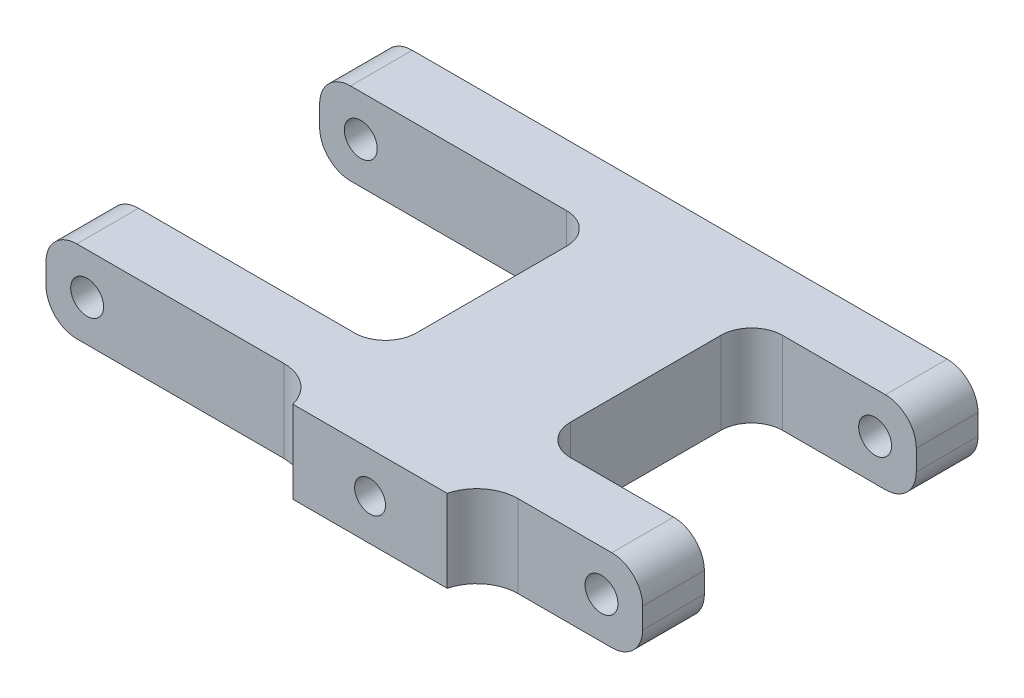
ISO-10303-21;
HEADER;
FILE_DESCRIPTION(('STEP AP214'),'2;1');
FILE_NAME('part.step','',(''),(''),'','','');
FILE_SCHEMA(('AUTOMOTIVE_DESIGN { 1 0 10303 214 1 1 1 1 }'));
ENDSEC;
DATA;
#1=APPLICATION_CONTEXT('core data for automotive mechanical design processes');
#2=APPLICATION_PROTOCOL_DEFINITION('international standard','automotive_design',2000,#1);
#3=PRODUCT_CONTEXT('',#1,'mechanical');
#4=PRODUCT('Part','Part','',(#3));
#5=PRODUCT_RELATED_PRODUCT_CATEGORY('part','',(#4));
#6=PRODUCT_DEFINITION_FORMATION('','',#4);
#7=PRODUCT_DEFINITION_CONTEXT('part definition',#1,'design');
#8=PRODUCT_DEFINITION('design','',#6,#7);
#9=PRODUCT_DEFINITION_SHAPE('','',#8);
#10=(LENGTH_UNIT() NAMED_UNIT(*) SI_UNIT(.MILLI.,.METRE.));
#11=(NAMED_UNIT(*) PLANE_ANGLE_UNIT() SI_UNIT($,.RADIAN.));
#12=(NAMED_UNIT(*) SI_UNIT($,.STERADIAN.) SOLID_ANGLE_UNIT());
#13=UNCERTAINTY_MEASURE_WITH_UNIT(LENGTH_MEASURE(1.E-05),#10,'distance_accuracy_value','');
#14=(GEOMETRIC_REPRESENTATION_CONTEXT(3) GLOBAL_UNCERTAINTY_ASSIGNED_CONTEXT((#13)) GLOBAL_UNIT_ASSIGNED_CONTEXT((#10,
#11,#12)) REPRESENTATION_CONTEXT('',''));
#15=CARTESIAN_POINT('',(0.,0.,0.));
#16=DIRECTION('',(0.,0.,1.));
#17=DIRECTION('',(1.,0.,0.));
#18=AXIS2_PLACEMENT_3D('',#15,#16,#17);
#19=CARTESIAN_POINT('',(0.,8.,32.6));
#20=DIRECTION('',(0.,0.,-1.));
#21=DIRECTION('',(-1.,0.,0.));
#22=AXIS2_PLACEMENT_3D('',#19,#20,#21);
#23=PLANE('',#22);
#24=CARTESIAN_POINT('',(4.,4.,32.6));
#25=DIRECTION('',(0.,0.,1.));
#26=DIRECTION('',(1.,0.,0.));
#27=AXIS2_PLACEMENT_3D('',#24,#25,#26);
#28=CIRCLE('',#27,1.6);
#29=CARTESIAN_POINT('',(5.6,4.,32.6));
#30=VERTEX_POINT('',#29);
#31=EDGE_CURVE('E254',#30,#30,#28,.T.);
#32=ORIENTED_EDGE('',*,*,#31,.F.);
#33=EDGE_LOOP('',(#32));
#34=FACE_BOUND('',#33,.T.);
#35=DIRECTION('',(1.,0.,0.));
#36=VECTOR('',#35,1.);
#37=CARTESIAN_POINT('',(0.,0.,32.6));
#38=LINE('',#37,#36);
#39=CARTESIAN_POINT('',(3.,0.,32.6));
#40=VERTEX_POINT('',#39);
#41=CARTESIAN_POINT('',(23.1270166537926,0.,32.6));
#42=VERTEX_POINT('',#41);
#43=EDGE_CURVE('E312',#40,#42,#38,.T.);
#44=ORIENTED_EDGE('',*,*,#43,.T.);
#45=DIRECTION('',(0.,-1.,0.));
#46=VECTOR('',#45,1.);
#47=CARTESIAN_POINT('',(23.1270166537926,8.,32.6));
#48=LINE('',#47,#46);
#49=CARTESIAN_POINT('',(23.1270166537926,8.,32.6));
#50=VERTEX_POINT('',#49);
#51=EDGE_CURVE('E54',#42,#50,#48,.F.);
#52=ORIENTED_EDGE('',*,*,#51,.T.);
#53=DIRECTION('',(1.,0.,0.));
#54=VECTOR('',#53,1.);
#55=CARTESIAN_POINT('',(0.,8.,32.6));
#56=LINE('',#55,#54);
#57=CARTESIAN_POINT('',(3.,8.,32.6));
#58=VERTEX_POINT('',#57);
#59=EDGE_CURVE('E305',#58,#50,#56,.T.);
#60=ORIENTED_EDGE('',*,*,#59,.F.);
#61=CARTESIAN_POINT('',(3.,5.,32.6));
#62=DIRECTION('',(0.,0.,-1.));
#63=DIRECTION('',(-1.,0.,0.));
#64=AXIS2_PLACEMENT_3D('',#61,#62,#63);
#65=CIRCLE('',#64,3.);
#66=CARTESIAN_POINT('',(0.,5.,32.6));
#67=VERTEX_POINT('',#66);
#68=EDGE_CURVE('E342',#58,#67,#65,.F.);
#69=ORIENTED_EDGE('',*,*,#68,.T.);
#70=DIRECTION('',(0.,-1.,0.));
#71=VECTOR('',#70,1.);
#72=CARTESIAN_POINT('',(0.,8.,32.6));
#73=LINE('',#72,#71);
#74=CARTESIAN_POINT('',(0.,3.,32.6));
#75=VERTEX_POINT('',#74);
#76=EDGE_CURVE('E325',#67,#75,#73,.T.);
#77=ORIENTED_EDGE('',*,*,#76,.T.);
#78=CARTESIAN_POINT('',(3.,3.,32.6));
#79=DIRECTION('',(0.,0.,-1.));
#80=DIRECTION('',(-1.,0.,0.));
#81=AXIS2_PLACEMENT_3D('',#78,#79,#80);
#82=CIRCLE('',#81,3.);
#83=EDGE_CURVE('E344',#75,#40,#82,.F.);
#84=ORIENTED_EDGE('',*,*,#83,.T.);
#85=EDGE_LOOP('',(#44,#52,#60,#69,#77,#84));
#86=FACE_BOUND('',#85,.T.);
#87=ADVANCED_FACE('F33',(#34,#86),#23,.F.);
#88=CARTESIAN_POINT('',(54.,4.,32.6));
#89=DIRECTION('',(0.,0.,1.));
#90=DIRECTION('',(1.,0.,0.));
#91=AXIS2_PLACEMENT_3D('',#88,#89,#90);
#92=CIRCLE('',#91,1.59999999999999);
#93=CARTESIAN_POINT('',(55.6,4.,32.6));
#94=VERTEX_POINT('',#93);
#95=EDGE_CURVE('E244',#94,#94,#92,.T.);
#96=ORIENTED_EDGE('',*,*,#95,.F.);
#97=EDGE_LOOP('',(#96));
#98=FACE_BOUND('',#97,.T.);
#99=CARTESIAN_POINT('',(45.8729833462074,8.,32.6));
#100=VERTEX_POINT('',#99);
#101=CARTESIAN_POINT('',(55.,8.,32.6));
#102=VERTEX_POINT('',#101);
#103=EDGE_CURVE('E308',#100,#102,#56,.T.);
#104=ORIENTED_EDGE('',*,*,#103,.F.);
#105=DIRECTION('',(0.,1.,0.));
#106=VECTOR('',#105,1.);
#107=CARTESIAN_POINT('',(45.8729833462074,8.,32.6));
#108=LINE('',#107,#106);
#109=CARTESIAN_POINT('',(45.8729833462074,0.,32.6));
#110=VERTEX_POINT('',#109);
#111=EDGE_CURVE('E448',#100,#110,#108,.F.);
#112=ORIENTED_EDGE('',*,*,#111,.T.);
#113=CARTESIAN_POINT('',(55.,0.,32.6));
#114=VERTEX_POINT('',#113);
#115=EDGE_CURVE('E299',#110,#114,#38,.T.);
#116=ORIENTED_EDGE('',*,*,#115,.T.);
#117=CARTESIAN_POINT('',(55.,3.,32.6));
#118=DIRECTION('',(0.,0.,-1.));
#119=DIRECTION('',(-1.,0.,0.));
#120=AXIS2_PLACEMENT_3D('',#117,#118,#119);
#121=CIRCLE('',#120,3.);
#122=CARTESIAN_POINT('',(58.,3.,32.6));
#123=VERTEX_POINT('',#122);
#124=EDGE_CURVE('E340',#114,#123,#121,.F.);
#125=ORIENTED_EDGE('',*,*,#124,.T.);
#126=DIRECTION('',(0.,-1.,0.));
#127=VECTOR('',#126,1.);
#128=CARTESIAN_POINT('',(58.,8.,32.6));
#129=LINE('',#128,#127);
#130=CARTESIAN_POINT('',(58.,5.,32.6));
#131=VERTEX_POINT('',#130);
#132=EDGE_CURVE('E322',#131,#123,#129,.T.);
#133=ORIENTED_EDGE('',*,*,#132,.F.);
#134=CARTESIAN_POINT('',(55.,5.,32.6));
#135=DIRECTION('',(0.,0.,-1.));
#136=DIRECTION('',(-1.,0.,0.));
#137=AXIS2_PLACEMENT_3D('',#134,#135,#136);
#138=CIRCLE('',#137,3.);
#139=EDGE_CURVE('E337',#131,#102,#138,.F.);
#140=ORIENTED_EDGE('',*,*,#139,.T.);
#141=EDGE_LOOP('',(#104,#112,#116,#125,#133,#140));
#142=FACE_BOUND('',#141,.T.);
#143=ADVANCED_FACE('F460',(#98,#142),#23,.F.);
#144=CARTESIAN_POINT('',(0.,8.,0.));
#145=DIRECTION('',(1.,0.,0.));
#146=DIRECTION('',(0.,0.,-1.));
#147=AXIS2_PLACEMENT_3D('',#144,#145,#146);
#148=PLANE('',#147);
#149=DIRECTION('',(0.,-1.,0.));
#150=VECTOR('',#149,1.);
#151=CARTESIAN_POINT('',(0.,8.,0.));
#152=LINE('',#151,#150);
#153=CARTESIAN_POINT('',(0.,5.,0.));
#154=VERTEX_POINT('',#153);
#155=CARTESIAN_POINT('',(0.,3.,0.));
#156=VERTEX_POINT('',#155);
#157=EDGE_CURVE('E311',#154,#156,#152,.T.);
#158=ORIENTED_EDGE('',*,*,#157,.T.);
#159=DIRECTION('',(0.,0.,1.));
#160=VECTOR('',#159,1.);
#161=CARTESIAN_POINT('',(0.,3.,0.));
#162=LINE('',#161,#160);
#163=CARTESIAN_POINT('',(0.,3.,6.));
#164=VERTEX_POINT('',#163);
#165=EDGE_CURVE('E376',#156,#164,#162,.T.);
#166=ORIENTED_EDGE('',*,*,#165,.T.);
#167=DIRECTION('',(0.,-1.,0.));
#168=VECTOR('',#167,1.);
#169=CARTESIAN_POINT('',(0.,8.,6.));
#170=LINE('',#169,#168);
#171=CARTESIAN_POINT('',(0.,5.,6.));
#172=VERTEX_POINT('',#171);
#173=EDGE_CURVE('E264',#172,#164,#170,.T.);
#174=ORIENTED_EDGE('',*,*,#173,.F.);
#175=DIRECTION('',(0.,0.,1.));
#176=VECTOR('',#175,1.);
#177=CARTESIAN_POINT('',(0.,5.,0.));
#178=LINE('',#177,#176);
#179=EDGE_CURVE('E374',#172,#154,#178,.F.);
#180=ORIENTED_EDGE('',*,*,#179,.T.);
#181=EDGE_LOOP('',(#158,#166,#174,#180));
#182=FACE_BOUND('',#181,.T.);
#183=ADVANCED_FACE('F481',(#182),#148,.F.);
#184=CARTESIAN_POINT('',(58.,8.,0.));
#185=DIRECTION('',(-1.,0.,0.));
#186=DIRECTION('',(0.,0.,1.));
#187=AXIS2_PLACEMENT_3D('',#184,#185,#186);
#188=PLANE('',#187);
#189=ORIENTED_EDGE('',*,*,#132,.T.);
#190=DIRECTION('',(0.,0.,-1.));
#191=VECTOR('',#190,1.);
#192=CARTESIAN_POINT('',(58.,3.,0.));
#193=LINE('',#192,#191);
#194=CARTESIAN_POINT('',(58.,3.,26.6));
#195=VERTEX_POINT('',#194);
#196=EDGE_CURVE('E404',#123,#195,#193,.T.);
#197=ORIENTED_EDGE('',*,*,#196,.T.);
#198=DIRECTION('',(0.,-1.,0.));
#199=VECTOR('',#198,1.);
#200=CARTESIAN_POINT('',(58.,8.,26.6));
#201=LINE('',#200,#199);
#202=CARTESIAN_POINT('',(58.,5.,26.6));
#203=VERTEX_POINT('',#202);
#204=EDGE_CURVE('E279',#203,#195,#201,.T.);
#205=ORIENTED_EDGE('',*,*,#204,.F.);
#206=DIRECTION('',(0.,0.,-1.));
#207=VECTOR('',#206,1.);
#208=CARTESIAN_POINT('',(58.,5.,32.6));
#209=LINE('',#208,#207);
#210=EDGE_CURVE('E402',#203,#131,#209,.F.);
#211=ORIENTED_EDGE('',*,*,#210,.T.);
#212=EDGE_LOOP('',(#189,#197,#205,#211));
#213=FACE_BOUND('',#212,.T.);
#214=ADVANCED_FACE('F491',(#213),#188,.F.);
#215=DIRECTION('',(0.,1.,0.));
#216=VECTOR('',#215,1.);
#217=CARTESIAN_POINT('',(0.,8.,26.6));
#218=LINE('',#217,#216);
#219=CARTESIAN_POINT('',(0.,3.,26.6));
#220=VERTEX_POINT('',#219);
#221=CARTESIAN_POINT('',(0.,5.,26.6));
#222=VERTEX_POINT('',#221);
#223=EDGE_CURVE('E269',#220,#222,#218,.T.);
#224=ORIENTED_EDGE('',*,*,#223,.F.);
#225=DIRECTION('',(0.,0.,1.));
#226=VECTOR('',#225,1.);
#227=CARTESIAN_POINT('',(0.,3.,0.));
#228=LINE('',#227,#226);
#229=EDGE_CURVE('E334',#220,#75,#228,.T.);
#230=ORIENTED_EDGE('',*,*,#229,.T.);
#231=ORIENTED_EDGE('',*,*,#76,.F.);
#232=DIRECTION('',(0.,0.,1.));
#233=VECTOR('',#232,1.);
#234=CARTESIAN_POINT('',(0.,5.,26.6));
#235=LINE('',#234,#233);
#236=EDGE_CURVE('E328',#67,#222,#235,.F.);
#237=ORIENTED_EDGE('',*,*,#236,.T.);
#238=EDGE_LOOP('',(#224,#230,#231,#237));
#239=FACE_BOUND('',#238,.T.);
#240=ADVANCED_FACE('F488',(#239),#148,.F.);
#241=DIRECTION('',(0.,-1.,0.));
#242=VECTOR('',#241,1.);
#243=CARTESIAN_POINT('',(58.,8.,0.));
#244=LINE('',#243,#242);
#245=CARTESIAN_POINT('',(58.,5.,0.));
#246=VERTEX_POINT('',#245);
#247=CARTESIAN_POINT('',(58.,3.,0.));
#248=VERTEX_POINT('',#247);
#249=EDGE_CURVE('E319',#246,#248,#244,.T.);
#250=ORIENTED_EDGE('',*,*,#249,.F.);
#251=DIRECTION('',(0.,0.,-1.));
#252=VECTOR('',#251,1.);
#253=CARTESIAN_POINT('',(58.,5.,6.));
#254=LINE('',#253,#252);
#255=CARTESIAN_POINT('',(58.,5.,6.));
#256=VERTEX_POINT('',#255);
#257=EDGE_CURVE('E395',#246,#256,#254,.F.);
#258=ORIENTED_EDGE('',*,*,#257,.T.);
#259=DIRECTION('',(0.,1.,0.));
#260=VECTOR('',#259,1.);
#261=CARTESIAN_POINT('',(58.,8.,6.));
#262=LINE('',#261,#260);
#263=CARTESIAN_POINT('',(58.,3.,6.));
#264=VERTEX_POINT('',#263);
#265=EDGE_CURVE('E289',#264,#256,#262,.T.);
#266=ORIENTED_EDGE('',*,*,#265,.F.);
#267=DIRECTION('',(0.,0.,-1.));
#268=VECTOR('',#267,1.);
#269=CARTESIAN_POINT('',(58.,3.,0.));
#270=LINE('',#269,#268);
#271=EDGE_CURVE('E392',#264,#248,#270,.T.);
#272=ORIENTED_EDGE('',*,*,#271,.T.);
#273=EDGE_LOOP('',(#250,#258,#266,#272));
#274=FACE_BOUND('',#273,.T.);
#275=ADVANCED_FACE('F486',(#274),#188,.F.);
#276=CARTESIAN_POINT('',(0.,8.,0.));
#277=DIRECTION('',(0.,0.,1.));
#278=DIRECTION('',(1.,0.,0.));
#279=AXIS2_PLACEMENT_3D('',#276,#277,#278);
#280=PLANE('',#279);
#281=CARTESIAN_POINT('',(54.,4.,0.));
#282=DIRECTION('',(0.,0.,1.));
#283=DIRECTION('',(1.,0.,0.));
#284=AXIS2_PLACEMENT_3D('',#281,#282,#283);
#285=CIRCLE('',#284,1.59999999999999);
#286=CARTESIAN_POINT('',(55.6,4.,0.));
#287=VERTEX_POINT('',#286);
#288=EDGE_CURVE('E245',#287,#287,#285,.T.);
#289=ORIENTED_EDGE('',*,*,#288,.T.);
#290=EDGE_LOOP('',(#289));
#291=FACE_BOUND('',#290,.T.);
#292=CARTESIAN_POINT('',(4.,4.,0.));
#293=DIRECTION('',(0.,0.,1.));
#294=DIRECTION('',(1.,0.,0.));
#295=AXIS2_PLACEMENT_3D('',#292,#293,#294);
#296=CIRCLE('',#295,1.6);
#297=CARTESIAN_POINT('',(5.6,4.,0.));
#298=VERTEX_POINT('',#297);
#299=EDGE_CURVE('E255',#298,#298,#296,.T.);
#300=ORIENTED_EDGE('',*,*,#299,.T.);
#301=EDGE_LOOP('',(#300));
#302=FACE_BOUND('',#301,.T.);
#303=DIRECTION('',(-1.,0.,0.));
#304=VECTOR('',#303,1.);
#305=CARTESIAN_POINT('',(0.,0.,0.));
#306=LINE('',#305,#304);
#307=CARTESIAN_POINT('',(55.,0.,0.));
#308=VERTEX_POINT('',#307);
#309=CARTESIAN_POINT('',(3.,0.,0.));
#310=VERTEX_POINT('',#309);
#311=EDGE_CURVE('E314',#308,#310,#306,.T.);
#312=ORIENTED_EDGE('',*,*,#311,.T.);
#313=CARTESIAN_POINT('',(3.,3.,0.));
#314=DIRECTION('',(0.,0.,1.));
#315=DIRECTION('',(1.,0.,0.));
#316=AXIS2_PLACEMENT_3D('',#313,#314,#315);
#317=CIRCLE('',#316,3.);
#318=EDGE_CURVE('E390',#310,#156,#317,.F.);
#319=ORIENTED_EDGE('',*,*,#318,.T.);
#320=ORIENTED_EDGE('',*,*,#157,.F.);
#321=CARTESIAN_POINT('',(3.,5.,0.));
#322=DIRECTION('',(0.,0.,1.));
#323=DIRECTION('',(1.,0.,0.));
#324=AXIS2_PLACEMENT_3D('',#321,#322,#323);
#325=CIRCLE('',#324,3.);
#326=CARTESIAN_POINT('',(3.,8.,0.));
#327=VERTEX_POINT('',#326);
#328=EDGE_CURVE('E388',#154,#327,#325,.F.);
#329=ORIENTED_EDGE('',*,*,#328,.T.);
#330=DIRECTION('',(-1.,0.,0.));
#331=VECTOR('',#330,1.);
#332=CARTESIAN_POINT('',(0.,8.,0.));
#333=LINE('',#332,#331);
#334=CARTESIAN_POINT('',(55.,8.,0.));
#335=VERTEX_POINT('',#334);
#336=EDGE_CURVE('E307',#335,#327,#333,.T.);
#337=ORIENTED_EDGE('',*,*,#336,.F.);
#338=CARTESIAN_POINT('',(55.,5.,0.));
#339=DIRECTION('',(0.,0.,1.));
#340=DIRECTION('',(1.,0.,0.));
#341=AXIS2_PLACEMENT_3D('',#338,#339,#340);
#342=CIRCLE('',#341,3.);
#343=EDGE_CURVE('E386',#335,#246,#342,.F.);
#344=ORIENTED_EDGE('',*,*,#343,.T.);
#345=ORIENTED_EDGE('',*,*,#249,.T.);
#346=CARTESIAN_POINT('',(55.,3.,0.));
#347=DIRECTION('',(0.,0.,1.));
#348=DIRECTION('',(1.,0.,0.));
#349=AXIS2_PLACEMENT_3D('',#346,#347,#348);
#350=CIRCLE('',#349,3.);
#351=EDGE_CURVE('E384',#248,#308,#350,.F.);
#352=ORIENTED_EDGE('',*,*,#351,.T.);
#353=EDGE_LOOP('',(#312,#319,#320,#329,#337,#344,#345,#352));
#354=FACE_BOUND('',#353,.T.);
#355=ADVANCED_FACE('F577',(#291,#302,#354),#280,.F.);
#356=CARTESIAN_POINT('',(0.,8.,0.));
#357=DIRECTION('',(0.,1.,0.));
#358=DIRECTION('',(0.,0.,1.));
#359=AXIS2_PLACEMENT_3D('',#356,#357,#358);
#360=PLANE('',#359);
#361=DIRECTION('',(0.,0.,-1.));
#362=VECTOR('',#361,1.);
#363=CARTESIAN_POINT('',(27.,8.,6.));
#364=LINE('',#363,#362);
#365=CARTESIAN_POINT('',(27.,8.,23.6));
#366=VERTEX_POINT('',#365);
#367=CARTESIAN_POINT('',(27.,8.,9.));
#368=VERTEX_POINT('',#367);
#369=EDGE_CURVE('E268',#366,#368,#364,.T.);
#370=ORIENTED_EDGE('',*,*,#369,.F.);
#371=CARTESIAN_POINT('',(24.,8.,23.6));
#372=DIRECTION('',(0.,1.,0.));
#373=DIRECTION('',(0.,0.,1.));
#374=AXIS2_PLACEMENT_3D('',#371,#372,#373);
#375=CIRCLE('',#374,3.);
#376=CARTESIAN_POINT('',(24.,8.,26.6));
#377=VERTEX_POINT('',#376);
#378=EDGE_CURVE('E440',#366,#377,#375,.F.);
#379=ORIENTED_EDGE('',*,*,#378,.T.);
#380=DIRECTION('',(-1.,0.,0.));
#381=VECTOR('',#380,1.);
#382=CARTESIAN_POINT('',(27.,8.,26.6));
#383=LINE('',#382,#381);
#384=CARTESIAN_POINT('',(3.,8.,26.6));
#385=VERTEX_POINT('',#384);
#386=EDGE_CURVE('E280',#377,#385,#383,.T.);
#387=ORIENTED_EDGE('',*,*,#386,.T.);
#388=DIRECTION('',(0.,0.,1.));
#389=VECTOR('',#388,1.);
#390=CARTESIAN_POINT('',(3.,8.,32.6));
#391=LINE('',#390,#389);
#392=EDGE_CURVE('E371',#385,#58,#391,.T.);
#393=ORIENTED_EDGE('',*,*,#392,.T.);
#394=ORIENTED_EDGE('',*,*,#59,.T.);
#395=CARTESIAN_POINT('',(23.1270166537926,8.,36.6));
#396=DIRECTION('',(0.,1.,0.));
#397=DIRECTION('',(0.,0.,1.));
#398=AXIS2_PLACEMENT_3D('',#395,#396,#397);
#399=CIRCLE('',#398,4.);
#400=CARTESIAN_POINT('',(27.,8.,35.6));
#401=VERTEX_POINT('',#400);
#402=EDGE_CURVE('E11',#50,#401,#399,.F.);
#403=ORIENTED_EDGE('',*,*,#402,.T.);
#404=DIRECTION('',(-1.,0.,0.));
#405=VECTOR('',#404,1.);
#406=CARTESIAN_POINT('',(27.,8.,35.6));
#407=LINE('',#406,#405);
#408=CARTESIAN_POINT('',(42.,8.,35.6));
#409=VERTEX_POINT('',#408);
#410=EDGE_CURVE('E234',#409,#401,#407,.T.);
#411=ORIENTED_EDGE('',*,*,#410,.F.);
#412=CARTESIAN_POINT('',(45.8729833462074,8.,36.6));
#413=DIRECTION('',(0.,1.,0.));
#414=DIRECTION('',(0.,0.,1.));
#415=AXIS2_PLACEMENT_3D('',#412,#413,#414);
#416=CIRCLE('',#415,4.);
#417=EDGE_CURVE('E451',#409,#100,#416,.F.);
#418=ORIENTED_EDGE('',*,*,#417,.T.);
#419=ORIENTED_EDGE('',*,*,#103,.T.);
#420=DIRECTION('',(0.,0.,-1.));
#421=VECTOR('',#420,1.);
#422=CARTESIAN_POINT('',(55.,8.,26.6));
#423=LINE('',#422,#421);
#424=CARTESIAN_POINT('',(55.,8.,26.6));
#425=VERTEX_POINT('',#424);
#426=EDGE_CURVE('E362',#102,#425,#423,.T.);
#427=ORIENTED_EDGE('',*,*,#426,.T.);
#428=DIRECTION('',(1.,0.,0.));
#429=VECTOR('',#428,1.);
#430=CARTESIAN_POINT('',(42.,8.,26.6));
#431=LINE('',#430,#429);
#432=CARTESIAN_POINT('',(45.,8.,26.6));
#433=VERTEX_POINT('',#432);
#434=EDGE_CURVE('E297',#433,#425,#431,.T.);
#435=ORIENTED_EDGE('',*,*,#434,.F.);
#436=CARTESIAN_POINT('',(45.,8.,23.6));
#437=DIRECTION('',(0.,1.,0.));
#438=DIRECTION('',(0.,0.,1.));
#439=AXIS2_PLACEMENT_3D('',#436,#437,#438);
#440=CIRCLE('',#439,3.);
#441=CARTESIAN_POINT('',(42.,8.,23.6));
#442=VERTEX_POINT('',#441);
#443=EDGE_CURVE('E434',#433,#442,#440,.F.);
#444=ORIENTED_EDGE('',*,*,#443,.T.);
#445=DIRECTION('',(0.,0.,1.));
#446=VECTOR('',#445,1.);
#447=CARTESIAN_POINT('',(42.,8.,26.6));
#448=LINE('',#447,#446);
#449=CARTESIAN_POINT('',(42.,8.,9.));
#450=VERTEX_POINT('',#449);
#451=EDGE_CURVE('E288',#450,#442,#448,.T.);
#452=ORIENTED_EDGE('',*,*,#451,.F.);
#453=CARTESIAN_POINT('',(45.,8.,9.));
#454=DIRECTION('',(0.,1.,0.));
#455=DIRECTION('',(0.,0.,1.));
#456=AXIS2_PLACEMENT_3D('',#453,#454,#455);
#457=CIRCLE('',#456,3.);
#458=CARTESIAN_POINT('',(45.,8.,6.));
#459=VERTEX_POINT('',#458);
#460=EDGE_CURVE('E436',#450,#459,#457,.F.);
#461=ORIENTED_EDGE('',*,*,#460,.T.);
#462=DIRECTION('',(1.,0.,0.));
#463=VECTOR('',#462,1.);
#464=CARTESIAN_POINT('',(42.,8.,6.));
#465=LINE('',#464,#463);
#466=CARTESIAN_POINT('',(55.,8.,6.));
#467=VERTEX_POINT('',#466);
#468=EDGE_CURVE('E300',#459,#467,#465,.T.);
#469=ORIENTED_EDGE('',*,*,#468,.T.);
#470=DIRECTION('',(0.,0.,-1.));
#471=VECTOR('',#470,1.);
#472=CARTESIAN_POINT('',(55.,8.,0.));
#473=LINE('',#472,#471);
#474=EDGE_CURVE('E365',#467,#335,#473,.T.);
#475=ORIENTED_EDGE('',*,*,#474,.T.);
#476=ORIENTED_EDGE('',*,*,#336,.T.);
#477=DIRECTION('',(0.,0.,1.));
#478=VECTOR('',#477,1.);
#479=CARTESIAN_POINT('',(3.,8.,6.));
#480=LINE('',#479,#478);
#481=CARTESIAN_POINT('',(3.,8.,6.));
#482=VERTEX_POINT('',#481);
#483=EDGE_CURVE('E368',#327,#482,#480,.T.);
#484=ORIENTED_EDGE('',*,*,#483,.T.);
#485=DIRECTION('',(-1.,0.,0.));
#486=VECTOR('',#485,1.);
#487=CARTESIAN_POINT('',(27.,8.,6.));
#488=LINE('',#487,#486);
#489=CARTESIAN_POINT('',(24.,8.,6.));
#490=VERTEX_POINT('',#489);
#491=EDGE_CURVE('E277',#490,#482,#488,.T.);
#492=ORIENTED_EDGE('',*,*,#491,.F.);
#493=CARTESIAN_POINT('',(24.,8.,9.));
#494=DIRECTION('',(0.,1.,0.));
#495=DIRECTION('',(0.,0.,1.));
#496=AXIS2_PLACEMENT_3D('',#493,#494,#495);
#497=CIRCLE('',#496,3.);
#498=EDGE_CURVE('E446',#490,#368,#497,.F.);
#499=ORIENTED_EDGE('',*,*,#498,.T.);
#500=EDGE_LOOP('',(#370,#379,#387,#393,#394,#403,#411,#418,#419,#427,#435,#444,#452,#461,#469,
#475,#476,#484,#492,#499));
#501=FACE_BOUND('',#500,.T.);
#502=ADVANCED_FACE('F456',(#501),#360,.T.);
#503=CARTESIAN_POINT('',(0.,0.,0.));
#504=DIRECTION('',(0.,1.,0.));
#505=DIRECTION('',(0.,0.,1.));
#506=AXIS2_PLACEMENT_3D('',#503,#504,#505);
#507=PLANE('',#506);
#508=ORIENTED_EDGE('',*,*,#43,.F.);
#509=DIRECTION('',(0.,0.,1.));
#510=VECTOR('',#509,1.);
#511=CARTESIAN_POINT('',(3.,0.,0.));
#512=LINE('',#511,#510);
#513=CARTESIAN_POINT('',(3.,0.,26.6));
#514=VERTEX_POINT('',#513);
#515=EDGE_CURVE('E354',#40,#514,#512,.F.);
#516=ORIENTED_EDGE('',*,*,#515,.T.);
#517=DIRECTION('',(-1.,0.,0.));
#518=VECTOR('',#517,1.);
#519=CARTESIAN_POINT('',(27.,0.,26.6));
#520=LINE('',#519,#518);
#521=CARTESIAN_POINT('',(24.,0.,26.6));
#522=VERTEX_POINT('',#521);
#523=EDGE_CURVE('E282',#522,#514,#520,.T.);
#524=ORIENTED_EDGE('',*,*,#523,.F.);
#525=CARTESIAN_POINT('',(24.,0.,23.6));
#526=DIRECTION('',(0.,1.,0.));
#527=DIRECTION('',(0.,0.,1.));
#528=AXIS2_PLACEMENT_3D('',#525,#526,#527);
#529=CIRCLE('',#528,3.);
#530=CARTESIAN_POINT('',(27.,0.,23.6));
#531=VERTEX_POINT('',#530);
#532=EDGE_CURVE('E442',#522,#531,#529,.T.);
#533=ORIENTED_EDGE('',*,*,#532,.T.);
#534=DIRECTION('',(0.,0.,1.));
#535=VECTOR('',#534,1.);
#536=CARTESIAN_POINT('',(27.,0.,6.));
#537=LINE('',#536,#535);
#538=CARTESIAN_POINT('',(27.,0.,9.));
#539=VERTEX_POINT('',#538);
#540=EDGE_CURVE('E265',#539,#531,#537,.T.);
#541=ORIENTED_EDGE('',*,*,#540,.F.);
#542=CARTESIAN_POINT('',(24.,0.,9.));
#543=DIRECTION('',(0.,1.,0.));
#544=DIRECTION('',(0.,0.,1.));
#545=AXIS2_PLACEMENT_3D('',#542,#543,#544);
#546=CIRCLE('',#545,3.);
#547=CARTESIAN_POINT('',(24.,0.,6.));
#548=VERTEX_POINT('',#547);
#549=EDGE_CURVE('E444',#539,#548,#546,.T.);
#550=ORIENTED_EDGE('',*,*,#549,.T.);
#551=DIRECTION('',(-1.,0.,0.));
#552=VECTOR('',#551,1.);
#553=CARTESIAN_POINT('',(27.,0.,6.));
#554=LINE('',#553,#552);
#555=CARTESIAN_POINT('',(3.,0.,6.));
#556=VERTEX_POINT('',#555);
#557=EDGE_CURVE('E272',#548,#556,#554,.T.);
#558=ORIENTED_EDGE('',*,*,#557,.T.);
#559=DIRECTION('',(0.,0.,1.));
#560=VECTOR('',#559,1.);
#561=CARTESIAN_POINT('',(3.,0.,0.));
#562=LINE('',#561,#560);
#563=EDGE_CURVE('E352',#556,#310,#562,.F.);
#564=ORIENTED_EDGE('',*,*,#563,.T.);
#565=ORIENTED_EDGE('',*,*,#311,.F.);
#566=DIRECTION('',(0.,0.,-1.));
#567=VECTOR('',#566,1.);
#568=CARTESIAN_POINT('',(55.,0.,0.));
#569=LINE('',#568,#567);
#570=CARTESIAN_POINT('',(55.,0.,6.));
#571=VERTEX_POINT('',#570);
#572=EDGE_CURVE('E349',#308,#571,#569,.F.);
#573=ORIENTED_EDGE('',*,*,#572,.T.);
#574=DIRECTION('',(1.,0.,0.));
#575=VECTOR('',#574,1.);
#576=CARTESIAN_POINT('',(42.,0.,6.));
#577=LINE('',#576,#575);
#578=CARTESIAN_POINT('',(45.,0.,6.));
#579=VERTEX_POINT('',#578);
#580=EDGE_CURVE('E302',#579,#571,#577,.T.);
#581=ORIENTED_EDGE('',*,*,#580,.F.);
#582=CARTESIAN_POINT('',(45.,0.,9.));
#583=DIRECTION('',(0.,1.,0.));
#584=DIRECTION('',(0.,0.,1.));
#585=AXIS2_PLACEMENT_3D('',#582,#583,#584);
#586=CIRCLE('',#585,3.);
#587=CARTESIAN_POINT('',(42.,0.,9.));
#588=VERTEX_POINT('',#587);
#589=EDGE_CURVE('E438',#579,#588,#586,.T.);
#590=ORIENTED_EDGE('',*,*,#589,.T.);
#591=DIRECTION('',(0.,0.,-1.));
#592=VECTOR('',#591,1.);
#593=CARTESIAN_POINT('',(42.,0.,26.6));
#594=LINE('',#593,#592);
#595=CARTESIAN_POINT('',(42.,0.,23.6));
#596=VERTEX_POINT('',#595);
#597=EDGE_CURVE('E285',#596,#588,#594,.T.);
#598=ORIENTED_EDGE('',*,*,#597,.F.);
#599=CARTESIAN_POINT('',(45.,0.,23.6));
#600=DIRECTION('',(0.,1.,0.));
#601=DIRECTION('',(0.,0.,1.));
#602=AXIS2_PLACEMENT_3D('',#599,#600,#601);
#603=CIRCLE('',#602,3.);
#604=CARTESIAN_POINT('',(45.,0.,26.6));
#605=VERTEX_POINT('',#604);
#606=EDGE_CURVE('E432',#596,#605,#603,.T.);
#607=ORIENTED_EDGE('',*,*,#606,.T.);
#608=DIRECTION('',(1.,0.,0.));
#609=VECTOR('',#608,1.);
#610=CARTESIAN_POINT('',(42.,0.,26.6));
#611=LINE('',#610,#609);
#612=CARTESIAN_POINT('',(55.,0.,26.6));
#613=VERTEX_POINT('',#612);
#614=EDGE_CURVE('E292',#605,#613,#611,.T.);
#615=ORIENTED_EDGE('',*,*,#614,.T.);
#616=DIRECTION('',(0.,0.,-1.));
#617=VECTOR('',#616,1.);
#618=CARTESIAN_POINT('',(55.,0.,0.));
#619=LINE('',#618,#617);
#620=EDGE_CURVE('E346',#613,#114,#619,.F.);
#621=ORIENTED_EDGE('',*,*,#620,.T.);
#622=ORIENTED_EDGE('',*,*,#115,.F.);
#623=CARTESIAN_POINT('',(45.8729833462074,0.,36.6));
#624=DIRECTION('',(0.,1.,0.));
#625=DIRECTION('',(0.,0.,1.));
#626=AXIS2_PLACEMENT_3D('',#623,#624,#625);
#627=CIRCLE('',#626,4.);
#628=CARTESIAN_POINT('',(42.,0.,35.6));
#629=VERTEX_POINT('',#628);
#630=EDGE_CURVE('E220',#110,#629,#627,.T.);
#631=ORIENTED_EDGE('',*,*,#630,.T.);
#632=DIRECTION('',(1.,0.,0.));
#633=VECTOR('',#632,1.);
#634=CARTESIAN_POINT('',(27.,0.,35.6));
#635=LINE('',#634,#633);
#636=CARTESIAN_POINT('',(27.,0.,35.6));
#637=VERTEX_POINT('',#636);
#638=EDGE_CURVE('E222',#637,#629,#635,.T.);
#639=ORIENTED_EDGE('',*,*,#638,.F.);
#640=CARTESIAN_POINT('',(23.1270166537926,0.,36.6));
#641=DIRECTION('',(0.,1.,0.));
#642=DIRECTION('',(0.,0.,1.));
#643=AXIS2_PLACEMENT_3D('',#640,#641,#642);
#644=CIRCLE('',#643,4.);
#645=EDGE_CURVE('E41',#637,#42,#644,.T.);
#646=ORIENTED_EDGE('',*,*,#645,.T.);
#647=EDGE_LOOP('',(#508,#516,#524,#533,#541,#550,#558,#564,#565,#573,#581,#590,#598,#607,#615,
#621,#622,#631,#639,#646));
#648=FACE_BOUND('',#647,.T.);
#649=ADVANCED_FACE('F223',(#648),#507,.F.);
#650=CARTESIAN_POINT('',(42.,8.,26.6));
#651=DIRECTION('',(0.,0.,1.));
#652=DIRECTION('',(1.,0.,0.));
#653=AXIS2_PLACEMENT_3D('',#650,#651,#652);
#654=PLANE('',#653);
#655=CARTESIAN_POINT('',(54.,4.,26.6));
#656=DIRECTION('',(0.,0.,1.));
#657=DIRECTION('',(1.,0.,0.));
#658=AXIS2_PLACEMENT_3D('',#655,#656,#657);
#659=CIRCLE('',#658,1.59999999999999);
#660=CARTESIAN_POINT('',(55.6,4.,26.6));
#661=VERTEX_POINT('',#660);
#662=EDGE_CURVE('E251',#661,#661,#659,.T.);
#663=ORIENTED_EDGE('',*,*,#662,.T.);
#664=EDGE_LOOP('',(#663));
#665=FACE_BOUND('',#664,.T.);
#666=ORIENTED_EDGE('',*,*,#614,.F.);
#667=DIRECTION('',(0.,-1.,0.));
#668=VECTOR('',#667,1.);
#669=CARTESIAN_POINT('',(45.,8.,26.6));
#670=LINE('',#669,#668);
#671=EDGE_CURVE('E418',#605,#433,#670,.F.);
#672=ORIENTED_EDGE('',*,*,#671,.T.);
#673=ORIENTED_EDGE('',*,*,#434,.T.);
#674=CARTESIAN_POINT('',(55.,5.,26.6));
#675=DIRECTION('',(0.,0.,1.));
#676=DIRECTION('',(1.,0.,0.));
#677=AXIS2_PLACEMENT_3D('',#674,#675,#676);
#678=CIRCLE('',#677,3.);
#679=EDGE_CURVE('E407',#425,#203,#678,.F.);
#680=ORIENTED_EDGE('',*,*,#679,.T.);
#681=ORIENTED_EDGE('',*,*,#204,.T.);
#682=CARTESIAN_POINT('',(55.,3.,26.6));
#683=DIRECTION('',(0.,0.,1.));
#684=DIRECTION('',(1.,0.,0.));
#685=AXIS2_PLACEMENT_3D('',#682,#683,#684);
#686=CIRCLE('',#685,3.);
#687=EDGE_CURVE('E409',#195,#613,#686,.F.);
#688=ORIENTED_EDGE('',*,*,#687,.T.);
#689=EDGE_LOOP('',(#666,#672,#673,#680,#681,#688));
#690=FACE_BOUND('',#689,.T.);
#691=ADVANCED_FACE('F615',(#665,#690),#654,.F.);
#692=CARTESIAN_POINT('',(42.,8.,6.));
#693=DIRECTION('',(0.,0.,-1.));
#694=DIRECTION('',(0.,1.,0.));
#695=AXIS2_PLACEMENT_3D('',#692,#693,#694);
#696=PLANE('',#695);
#697=CARTESIAN_POINT('',(54.,4.,6.));
#698=DIRECTION('',(0.,0.,-1.));
#699=DIRECTION('',(0.,1.,0.));
#700=AXIS2_PLACEMENT_3D('',#697,#698,#699);
#701=CIRCLE('',#700,1.59999999999999);
#702=CARTESIAN_POINT('',(54.,5.59999999999999,6.));
#703=VERTEX_POINT('',#702);
#704=EDGE_CURVE('E248',#703,#703,#701,.T.);
#705=ORIENTED_EDGE('',*,*,#704,.T.);
#706=EDGE_LOOP('',(#705));
#707=FACE_BOUND('',#706,.T.);
#708=ORIENTED_EDGE('',*,*,#468,.F.);
#709=DIRECTION('',(0.,1.,0.));
#710=VECTOR('',#709,1.);
#711=CARTESIAN_POINT('',(45.,8.,6.));
#712=LINE('',#711,#710);
#713=EDGE_CURVE('E420',#459,#579,#712,.F.);
#714=ORIENTED_EDGE('',*,*,#713,.T.);
#715=ORIENTED_EDGE('',*,*,#580,.T.);
#716=CARTESIAN_POINT('',(55.,3.,6.));
#717=DIRECTION('',(0.,0.,-1.));
#718=DIRECTION('',(0.,1.,0.));
#719=AXIS2_PLACEMENT_3D('',#716,#717,#718);
#720=CIRCLE('',#719,3.);
#721=EDGE_CURVE('E397',#571,#264,#720,.F.);
#722=ORIENTED_EDGE('',*,*,#721,.T.);
#723=ORIENTED_EDGE('',*,*,#265,.T.);
#724=CARTESIAN_POINT('',(55.,5.,6.));
#725=DIRECTION('',(0.,0.,-1.));
#726=DIRECTION('',(0.,1.,0.));
#727=AXIS2_PLACEMENT_3D('',#724,#725,#726);
#728=CIRCLE('',#727,3.);
#729=EDGE_CURVE('E399',#256,#467,#728,.F.);
#730=ORIENTED_EDGE('',*,*,#729,.T.);
#731=EDGE_LOOP('',(#708,#714,#715,#722,#723,#730));
#732=FACE_BOUND('',#731,.T.);
#733=ADVANCED_FACE('F588',(#707,#732),#696,.F.);
#734=CARTESIAN_POINT('',(42.,0.,0.));
#735=DIRECTION('',(1.,0.,0.));
#736=DIRECTION('',(0.,0.,-1.));
#737=AXIS2_PLACEMENT_3D('',#734,#735,#736);
#738=PLANE('',#737);
#739=ORIENTED_EDGE('',*,*,#451,.T.);
#740=DIRECTION('',(0.,-1.,0.));
#741=VECTOR('',#740,1.);
#742=CARTESIAN_POINT('',(42.,0.,23.6));
#743=LINE('',#742,#741);
#744=EDGE_CURVE('E415',#442,#596,#743,.T.);
#745=ORIENTED_EDGE('',*,*,#744,.T.);
#746=ORIENTED_EDGE('',*,*,#597,.T.);
#747=DIRECTION('',(0.,1.,0.));
#748=VECTOR('',#747,1.);
#749=CARTESIAN_POINT('',(42.,0.,9.));
#750=LINE('',#749,#748);
#751=EDGE_CURVE('E412',#588,#450,#750,.T.);
#752=ORIENTED_EDGE('',*,*,#751,.T.);
#753=EDGE_LOOP('',(#739,#745,#746,#752));
#754=FACE_BOUND('',#753,.T.);
#755=ADVANCED_FACE('F622',(#754),#738,.T.);
#756=CARTESIAN_POINT('',(27.,8.,6.));
#757=DIRECTION('',(0.,0.,-1.));
#758=DIRECTION('',(-1.,0.,0.));
#759=AXIS2_PLACEMENT_3D('',#756,#757,#758);
#760=PLANE('',#759);
#761=CARTESIAN_POINT('',(4.,4.,6.));
#762=DIRECTION('',(0.,0.,-1.));
#763=DIRECTION('',(-1.,0.,0.));
#764=AXIS2_PLACEMENT_3D('',#761,#762,#763);
#765=CIRCLE('',#764,1.6);
#766=CARTESIAN_POINT('',(2.4,4.,6.));
#767=VERTEX_POINT('',#766);
#768=EDGE_CURVE('E261',#767,#767,#765,.T.);
#769=ORIENTED_EDGE('',*,*,#768,.T.);
#770=EDGE_LOOP('',(#769));
#771=FACE_BOUND('',#770,.T.);
#772=ORIENTED_EDGE('',*,*,#557,.F.);
#773=DIRECTION('',(0.,-1.,0.));
#774=VECTOR('',#773,1.);
#775=CARTESIAN_POINT('',(24.,8.,6.));
#776=LINE('',#775,#774);
#777=EDGE_CURVE('E430',#548,#490,#776,.F.);
#778=ORIENTED_EDGE('',*,*,#777,.T.);
#779=ORIENTED_EDGE('',*,*,#491,.T.);
#780=CARTESIAN_POINT('',(3.,5.,6.));
#781=DIRECTION('',(0.,0.,-1.));
#782=DIRECTION('',(-1.,0.,0.));
#783=AXIS2_PLACEMENT_3D('',#780,#781,#782);
#784=CIRCLE('',#783,3.);
#785=EDGE_CURVE('E379',#482,#172,#784,.F.);
#786=ORIENTED_EDGE('',*,*,#785,.T.);
#787=ORIENTED_EDGE('',*,*,#173,.T.);
#788=CARTESIAN_POINT('',(3.,3.,6.));
#789=DIRECTION('',(0.,0.,-1.));
#790=DIRECTION('',(-1.,0.,0.));
#791=AXIS2_PLACEMENT_3D('',#788,#789,#790);
#792=CIRCLE('',#791,3.);
#793=EDGE_CURVE('E381',#164,#556,#792,.F.);
#794=ORIENTED_EDGE('',*,*,#793,.T.);
#795=EDGE_LOOP('',(#772,#778,#779,#786,#787,#794));
#796=FACE_BOUND('',#795,.T.);
#797=ADVANCED_FACE('F569',(#771,#796),#760,.F.);
#798=CARTESIAN_POINT('',(27.,8.,26.6));
#799=DIRECTION('',(0.,0.,1.));
#800=DIRECTION('',(1.,0.,0.));
#801=AXIS2_PLACEMENT_3D('',#798,#799,#800);
#802=PLANE('',#801);
#803=CARTESIAN_POINT('',(4.,4.,26.6));
#804=DIRECTION('',(0.,0.,1.));
#805=DIRECTION('',(1.,0.,0.));
#806=AXIS2_PLACEMENT_3D('',#803,#804,#805);
#807=CIRCLE('',#806,1.6);
#808=CARTESIAN_POINT('',(5.6,4.,26.6));
#809=VERTEX_POINT('',#808);
#810=EDGE_CURVE('E258',#809,#809,#807,.T.);
#811=ORIENTED_EDGE('',*,*,#810,.T.);
#812=EDGE_LOOP('',(#811));
#813=FACE_BOUND('',#812,.T.);
#814=ORIENTED_EDGE('',*,*,#386,.F.);
#815=DIRECTION('',(0.,1.,0.));
#816=VECTOR('',#815,1.);
#817=CARTESIAN_POINT('',(24.,8.,26.6));
#818=LINE('',#817,#816);
#819=EDGE_CURVE('E428',#377,#522,#818,.F.);
#820=ORIENTED_EDGE('',*,*,#819,.T.);
#821=ORIENTED_EDGE('',*,*,#523,.T.);
#822=CARTESIAN_POINT('',(3.,3.,26.6));
#823=DIRECTION('',(0.,0.,1.));
#824=DIRECTION('',(1.,0.,0.));
#825=AXIS2_PLACEMENT_3D('',#822,#823,#824);
#826=CIRCLE('',#825,3.);
#827=EDGE_CURVE('E360',#514,#220,#826,.F.);
#828=ORIENTED_EDGE('',*,*,#827,.T.);
#829=ORIENTED_EDGE('',*,*,#223,.T.);
#830=CARTESIAN_POINT('',(3.,5.,26.6));
#831=DIRECTION('',(0.,0.,1.));
#832=DIRECTION('',(1.,0.,0.));
#833=AXIS2_PLACEMENT_3D('',#830,#831,#832);
#834=CIRCLE('',#833,3.);
#835=EDGE_CURVE('E357',#222,#385,#834,.F.);
#836=ORIENTED_EDGE('',*,*,#835,.T.);
#837=EDGE_LOOP('',(#814,#820,#821,#828,#829,#836));
#838=FACE_BOUND('',#837,.T.);
#839=ADVANCED_FACE('F557',(#813,#838),#802,.F.);
#840=CARTESIAN_POINT('',(27.,0.,0.));
#841=DIRECTION('',(-1.,0.,0.));
#842=DIRECTION('',(0.,0.,1.));
#843=AXIS2_PLACEMENT_3D('',#840,#841,#842);
#844=PLANE('',#843);
#845=ORIENTED_EDGE('',*,*,#540,.T.);
#846=DIRECTION('',(0.,1.,0.));
#847=VECTOR('',#846,1.);
#848=CARTESIAN_POINT('',(27.,0.,23.6));
#849=LINE('',#848,#847);
#850=EDGE_CURVE('E425',#531,#366,#849,.T.);
#851=ORIENTED_EDGE('',*,*,#850,.T.);
#852=ORIENTED_EDGE('',*,*,#369,.T.);
#853=DIRECTION('',(0.,-1.,0.));
#854=VECTOR('',#853,1.);
#855=CARTESIAN_POINT('',(27.,0.,9.));
#856=LINE('',#855,#854);
#857=EDGE_CURVE('E422',#368,#539,#856,.T.);
#858=ORIENTED_EDGE('',*,*,#857,.T.);
#859=EDGE_LOOP('',(#845,#851,#852,#858));
#860=FACE_BOUND('',#859,.T.);
#861=ADVANCED_FACE('F550',(#860),#844,.T.);
#862=CARTESIAN_POINT('',(4.,4.,0.));
#863=DIRECTION('',(0.,0.,1.));
#864=DIRECTION('',(1.,0.,0.));
#865=AXIS2_PLACEMENT_3D('',#862,#863,#864);
#866=CYLINDRICAL_SURFACE('',#865,1.6);
#867=ORIENTED_EDGE('',*,*,#31,.T.);
#868=EDGE_LOOP('',(#867));
#869=FACE_BOUND('',#868,.T.);
#870=ORIENTED_EDGE('',*,*,#810,.F.);
#871=EDGE_LOOP('',(#870));
#872=FACE_BOUND('',#871,.T.);
#873=ADVANCED_FACE('F635',(#869,#872),#866,.F.);
#874=ORIENTED_EDGE('',*,*,#299,.F.);
#875=EDGE_LOOP('',(#874));
#876=FACE_BOUND('',#875,.T.);
#877=ORIENTED_EDGE('',*,*,#768,.F.);
#878=EDGE_LOOP('',(#877));
#879=FACE_BOUND('',#878,.T.);
#880=ADVANCED_FACE('F636',(#876,#879),#866,.F.);
#881=CARTESIAN_POINT('',(54.,4.,0.));
#882=DIRECTION('',(0.,0.,1.));
#883=DIRECTION('',(1.,0.,0.));
#884=AXIS2_PLACEMENT_3D('',#881,#882,#883);
#885=CYLINDRICAL_SURFACE('',#884,1.59999999999999);
#886=ORIENTED_EDGE('',*,*,#288,.F.);
#887=EDGE_LOOP('',(#886));
#888=FACE_BOUND('',#887,.T.);
#889=ORIENTED_EDGE('',*,*,#704,.F.);
#890=EDGE_LOOP('',(#889));
#891=FACE_BOUND('',#890,.T.);
#892=ADVANCED_FACE('F639',(#888,#891),#885,.F.);
#893=ORIENTED_EDGE('',*,*,#95,.T.);
#894=EDGE_LOOP('',(#893));
#895=FACE_BOUND('',#894,.T.);
#896=ORIENTED_EDGE('',*,*,#662,.F.);
#897=EDGE_LOOP('',(#896));
#898=FACE_BOUND('',#897,.T.);
#899=ADVANCED_FACE('F497',(#895,#898),#885,.F.);
#900=CARTESIAN_POINT('',(3.,3.,0.));
#901=DIRECTION('',(0.,0.,1.));
#902=DIRECTION('',(1.,0.,0.));
#903=AXIS2_PLACEMENT_3D('',#900,#901,#902);
#904=CYLINDRICAL_SURFACE('',#903,3.);
#905=ORIENTED_EDGE('',*,*,#827,.F.);
#906=ORIENTED_EDGE('',*,*,#515,.F.);
#907=ORIENTED_EDGE('',*,*,#83,.F.);
#908=ORIENTED_EDGE('',*,*,#229,.F.);
#909=EDGE_LOOP('',(#905,#906,#907,#908));
#910=FACE_BOUND('',#909,.T.);
#911=ADVANCED_FACE('F493',(#910),#904,.T.);
#912=CARTESIAN_POINT('',(3.,5.,0.));
#913=DIRECTION('',(0.,0.,-1.));
#914=DIRECTION('',(-1.,0.,0.));
#915=AXIS2_PLACEMENT_3D('',#912,#913,#914);
#916=CYLINDRICAL_SURFACE('',#915,3.);
#917=ORIENTED_EDGE('',*,*,#835,.F.);
#918=ORIENTED_EDGE('',*,*,#236,.F.);
#919=ORIENTED_EDGE('',*,*,#68,.F.);
#920=ORIENTED_EDGE('',*,*,#392,.F.);
#921=EDGE_LOOP('',(#917,#918,#919,#920));
#922=FACE_BOUND('',#921,.T.);
#923=ADVANCED_FACE('F496',(#922),#916,.T.);
#924=CARTESIAN_POINT('',(3.,3.,0.));
#925=DIRECTION('',(0.,0.,1.));
#926=DIRECTION('',(1.,0.,0.));
#927=AXIS2_PLACEMENT_3D('',#924,#925,#926);
#928=CYLINDRICAL_SURFACE('',#927,3.);
#929=ORIENTED_EDGE('',*,*,#318,.F.);
#930=ORIENTED_EDGE('',*,*,#563,.F.);
#931=ORIENTED_EDGE('',*,*,#793,.F.);
#932=ORIENTED_EDGE('',*,*,#165,.F.);
#933=EDGE_LOOP('',(#929,#930,#931,#932));
#934=FACE_BOUND('',#933,.T.);
#935=ADVANCED_FACE('F501',(#934),#928,.T.);
#936=CARTESIAN_POINT('',(3.,5.,0.));
#937=DIRECTION('',(0.,0.,-1.));
#938=DIRECTION('',(-1.,0.,0.));
#939=AXIS2_PLACEMENT_3D('',#936,#937,#938);
#940=CYLINDRICAL_SURFACE('',#939,3.);
#941=ORIENTED_EDGE('',*,*,#328,.F.);
#942=ORIENTED_EDGE('',*,*,#179,.F.);
#943=ORIENTED_EDGE('',*,*,#785,.F.);
#944=ORIENTED_EDGE('',*,*,#483,.F.);
#945=EDGE_LOOP('',(#941,#942,#943,#944));
#946=FACE_BOUND('',#945,.T.);
#947=ADVANCED_FACE('F505',(#946),#940,.T.);
#948=CARTESIAN_POINT('',(55.,5.,0.));
#949=DIRECTION('',(0.,0.,1.));
#950=DIRECTION('',(1.,0.,0.));
#951=AXIS2_PLACEMENT_3D('',#948,#949,#950);
#952=CYLINDRICAL_SURFACE('',#951,3.);
#953=ORIENTED_EDGE('',*,*,#729,.F.);
#954=ORIENTED_EDGE('',*,*,#257,.F.);
#955=ORIENTED_EDGE('',*,*,#343,.F.);
#956=ORIENTED_EDGE('',*,*,#474,.F.);
#957=EDGE_LOOP('',(#953,#954,#955,#956));
#958=FACE_BOUND('',#957,.T.);
#959=ADVANCED_FACE('F509',(#958),#952,.T.);
#960=CARTESIAN_POINT('',(55.,3.,0.));
#961=DIRECTION('',(0.,0.,-1.));
#962=DIRECTION('',(-1.,0.,0.));
#963=AXIS2_PLACEMENT_3D('',#960,#961,#962);
#964=CYLINDRICAL_SURFACE('',#963,3.);
#965=ORIENTED_EDGE('',*,*,#721,.F.);
#966=ORIENTED_EDGE('',*,*,#572,.F.);
#967=ORIENTED_EDGE('',*,*,#351,.F.);
#968=ORIENTED_EDGE('',*,*,#271,.F.);
#969=EDGE_LOOP('',(#965,#966,#967,#968));
#970=FACE_BOUND('',#969,.T.);
#971=ADVANCED_FACE('F513',(#970),#964,.T.);
#972=CARTESIAN_POINT('',(55.,3.,0.));
#973=DIRECTION('',(0.,0.,-1.));
#974=DIRECTION('',(-1.,0.,0.));
#975=AXIS2_PLACEMENT_3D('',#972,#973,#974);
#976=CYLINDRICAL_SURFACE('',#975,3.);
#977=ORIENTED_EDGE('',*,*,#124,.F.);
#978=ORIENTED_EDGE('',*,*,#620,.F.);
#979=ORIENTED_EDGE('',*,*,#687,.F.);
#980=ORIENTED_EDGE('',*,*,#196,.F.);
#981=EDGE_LOOP('',(#977,#978,#979,#980));
#982=FACE_BOUND('',#981,.T.);
#983=ADVANCED_FACE('F517',(#982),#976,.T.);
#984=CARTESIAN_POINT('',(55.,5.,0.));
#985=DIRECTION('',(0.,0.,1.));
#986=DIRECTION('',(1.,0.,0.));
#987=AXIS2_PLACEMENT_3D('',#984,#985,#986);
#988=CYLINDRICAL_SURFACE('',#987,3.);
#989=ORIENTED_EDGE('',*,*,#139,.F.);
#990=ORIENTED_EDGE('',*,*,#210,.F.);
#991=ORIENTED_EDGE('',*,*,#679,.F.);
#992=ORIENTED_EDGE('',*,*,#426,.F.);
#993=EDGE_LOOP('',(#989,#990,#991,#992));
#994=FACE_BOUND('',#993,.T.);
#995=ADVANCED_FACE('F521',(#994),#988,.T.);
#996=CARTESIAN_POINT('',(45.,0.,23.6));
#997=DIRECTION('',(0.,-1.,0.));
#998=DIRECTION('',(0.,0.,-1.));
#999=AXIS2_PLACEMENT_3D('',#996,#997,#998);
#1000=CYLINDRICAL_SURFACE('',#999,3.);
#1001=ORIENTED_EDGE('',*,*,#443,.F.);
#1002=ORIENTED_EDGE('',*,*,#671,.F.);
#1003=ORIENTED_EDGE('',*,*,#606,.F.);
#1004=ORIENTED_EDGE('',*,*,#744,.F.);
#1005=EDGE_LOOP('',(#1001,#1002,#1003,#1004));
#1006=FACE_BOUND('',#1005,.T.);
#1007=ADVANCED_FACE('F525',(#1006),#1000,.F.);
#1008=CARTESIAN_POINT('',(45.,0.,9.));
#1009=DIRECTION('',(0.,1.,0.));
#1010=DIRECTION('',(0.,0.,1.));
#1011=AXIS2_PLACEMENT_3D('',#1008,#1009,#1010);
#1012=CYLINDRICAL_SURFACE('',#1011,3.);
#1013=ORIENTED_EDGE('',*,*,#589,.F.);
#1014=ORIENTED_EDGE('',*,*,#713,.F.);
#1015=ORIENTED_EDGE('',*,*,#460,.F.);
#1016=ORIENTED_EDGE('',*,*,#751,.F.);
#1017=EDGE_LOOP('',(#1013,#1014,#1015,#1016));
#1018=FACE_BOUND('',#1017,.T.);
#1019=ADVANCED_FACE('F529',(#1018),#1012,.F.);
#1020=CARTESIAN_POINT('',(24.,0.,23.6));
#1021=DIRECTION('',(0.,1.,0.));
#1022=DIRECTION('',(0.,0.,1.));
#1023=AXIS2_PLACEMENT_3D('',#1020,#1021,#1022);
#1024=CYLINDRICAL_SURFACE('',#1023,3.);
#1025=ORIENTED_EDGE('',*,*,#532,.F.);
#1026=ORIENTED_EDGE('',*,*,#819,.F.);
#1027=ORIENTED_EDGE('',*,*,#378,.F.);
#1028=ORIENTED_EDGE('',*,*,#850,.F.);
#1029=EDGE_LOOP('',(#1025,#1026,#1027,#1028));
#1030=FACE_BOUND('',#1029,.T.);
#1031=ADVANCED_FACE('F533',(#1030),#1024,.F.);
#1032=CARTESIAN_POINT('',(24.,0.,9.));
#1033=DIRECTION('',(0.,-1.,0.));
#1034=DIRECTION('',(0.,0.,-1.));
#1035=AXIS2_PLACEMENT_3D('',#1032,#1033,#1034);
#1036=CYLINDRICAL_SURFACE('',#1035,3.);
#1037=ORIENTED_EDGE('',*,*,#498,.F.);
#1038=ORIENTED_EDGE('',*,*,#777,.F.);
#1039=ORIENTED_EDGE('',*,*,#549,.F.);
#1040=ORIENTED_EDGE('',*,*,#857,.F.);
#1041=EDGE_LOOP('',(#1037,#1038,#1039,#1040));
#1042=FACE_BOUND('',#1041,.T.);
#1043=ADVANCED_FACE('F536',(#1042),#1036,.F.);
#1044=CARTESIAN_POINT('',(0.,0.,35.6));
#1045=DIRECTION('',(0.,0.,1.));
#1046=DIRECTION('',(1.,0.,0.));
#1047=AXIS2_PLACEMENT_3D('',#1044,#1045,#1046);
#1048=PLANE('',#1047);
#1049=CARTESIAN_POINT('',(34.5,4.,35.6));
#1050=DIRECTION('',(0.,0.,1.));
#1051=DIRECTION('',(1.,0.,0.));
#1052=AXIS2_PLACEMENT_3D('',#1049,#1050,#1051);
#1053=CIRCLE('',#1052,1.5);
#1054=CARTESIAN_POINT('',(36.,4.,35.6));
#1055=VERTEX_POINT('',#1054);
#1056=EDGE_CURVE('E235',#1055,#1055,#1053,.T.);
#1057=ORIENTED_EDGE('',*,*,#1056,.F.);
#1058=EDGE_LOOP('',(#1057));
#1059=FACE_BOUND('',#1058,.T.);
#1060=DIRECTION('',(0.,-1.,0.));
#1061=VECTOR('',#1060,1.);
#1062=CARTESIAN_POINT('',(27.,8.,35.6));
#1063=LINE('',#1062,#1061);
#1064=EDGE_CURVE('E219',#401,#637,#1063,.T.);
#1065=ORIENTED_EDGE('',*,*,#1064,.T.);
#1066=ORIENTED_EDGE('',*,*,#638,.T.);
#1067=DIRECTION('',(0.,1.,0.));
#1068=VECTOR('',#1067,1.);
#1069=CARTESIAN_POINT('',(42.,8.,35.6));
#1070=LINE('',#1069,#1068);
#1071=EDGE_CURVE('E229',#629,#409,#1070,.T.);
#1072=ORIENTED_EDGE('',*,*,#1071,.T.);
#1073=ORIENTED_EDGE('',*,*,#410,.T.);
#1074=EDGE_LOOP('',(#1065,#1066,#1072,#1073));
#1075=FACE_BOUND('',#1074,.T.);
#1076=ADVANCED_FACE('F232',(#1059,#1075),#1048,.T.);
#1077=CARTESIAN_POINT('',(34.5,4.,35.6));
#1078=DIRECTION('',(0.,0.,-1.));
#1079=DIRECTION('',(-1.,0.,0.));
#1080=AXIS2_PLACEMENT_3D('',#1077,#1078,#1079);
#1081=CYLINDRICAL_SURFACE('',#1080,1.5);
#1082=ORIENTED_EDGE('',*,*,#1056,.T.);
#1083=EDGE_LOOP('',(#1082));
#1084=FACE_BOUND('',#1083,.T.);
#1085=CARTESIAN_POINT('',(34.5,4.,17.6));
#1086=DIRECTION('',(0.,0.,1.));
#1087=DIRECTION('',(1.,0.,0.));
#1088=AXIS2_PLACEMENT_3D('',#1085,#1086,#1087);
#1089=CIRCLE('',#1088,1.5);
#1090=CARTESIAN_POINT('',(36.,4.,17.6));
#1091=VERTEX_POINT('',#1090);
#1092=EDGE_CURVE('E238',#1091,#1091,#1089,.T.);
#1093=ORIENTED_EDGE('',*,*,#1092,.F.);
#1094=EDGE_LOOP('',(#1093));
#1095=FACE_BOUND('',#1094,.T.);
#1096=ADVANCED_FACE('F471',(#1084,#1095),#1081,.F.);
#1097=CARTESIAN_POINT('',(34.5,4.,17.6));
#1098=DIRECTION('',(0.,0.,1.));
#1099=DIRECTION('',(1.,0.,0.));
#1100=AXIS2_PLACEMENT_3D('',#1097,#1098,#1099);
#1101=PLANE('',#1100);
#1102=ORIENTED_EDGE('',*,*,#1092,.T.);
#1103=EDGE_LOOP('',(#1102));
#1104=FACE_BOUND('',#1103,.T.);
#1105=ADVANCED_FACE('F466',(#1104),#1101,.T.);
#1106=CARTESIAN_POINT('',(45.8729833462074,8.,36.6));
#1107=DIRECTION('',(0.,1.,0.));
#1108=DIRECTION('',(0.,0.,1.));
#1109=AXIS2_PLACEMENT_3D('',#1106,#1107,#1108);
#1110=CYLINDRICAL_SURFACE('',#1109,4.);
#1111=ORIENTED_EDGE('',*,*,#630,.F.);
#1112=ORIENTED_EDGE('',*,*,#111,.F.);
#1113=ORIENTED_EDGE('',*,*,#417,.F.);
#1114=ORIENTED_EDGE('',*,*,#1071,.F.);
#1115=EDGE_LOOP('',(#1111,#1112,#1113,#1114));
#1116=FACE_BOUND('',#1115,.T.);
#1117=ADVANCED_FACE('F464',(#1116),#1110,.F.);
#1118=CARTESIAN_POINT('',(23.1270166537926,8.,36.6));
#1119=DIRECTION('',(0.,-1.,0.));
#1120=DIRECTION('',(0.,0.,-1.));
#1121=AXIS2_PLACEMENT_3D('',#1118,#1119,#1120);
#1122=CYLINDRICAL_SURFACE('',#1121,4.);
#1123=ORIENTED_EDGE('',*,*,#402,.F.);
#1124=ORIENTED_EDGE('',*,*,#51,.F.);
#1125=ORIENTED_EDGE('',*,*,#645,.F.);
#1126=ORIENTED_EDGE('',*,*,#1064,.F.);
#1127=EDGE_LOOP('',(#1123,#1124,#1125,#1126));
#1128=FACE_BOUND('',#1127,.T.);
#1129=ADVANCED_FACE('F35',(#1128),#1122,.F.);
#1130=CLOSED_SHELL('',(#87,#143,#183,#214,#240,#275,#355,#502,#649,#691,#733,#755,#797,#839,
#861,#873,#880,#892,#899,#911,#923,#935,#947,#959,#971,#983,#995,#1007,#1019,#1031,#1043,#1076,
#1096,#1105,#1117,#1129));
#1131=MANIFOLD_SOLID_BREP('B2',#1130);
#1132=ADVANCED_BREP_SHAPE_REPRESENTATION('',(#18,#1131),#14);
#1133=SHAPE_DEFINITION_REPRESENTATION(#9,#1132);
ENDSEC;
END-ISO-10303-21;
